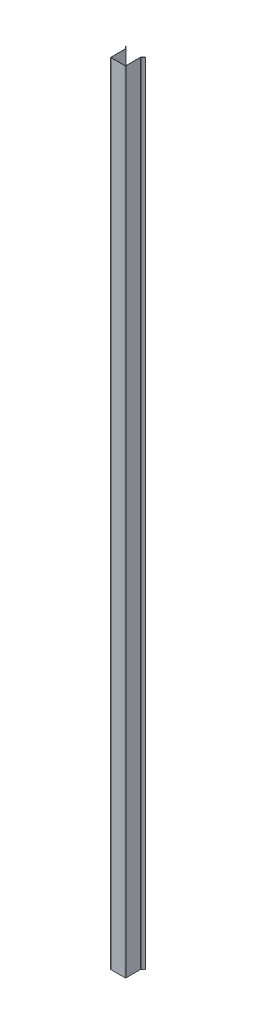
ISO-10303-21;
HEADER;
FILE_DESCRIPTION(('STEP AP214'),'2;1');
FILE_NAME('part.step','',(''),(''),'','','');
FILE_SCHEMA(('AUTOMOTIVE_DESIGN { 1 0 10303 214 1 1 1 1 }'));
ENDSEC;
DATA;
#1=APPLICATION_CONTEXT('core data for automotive mechanical design processes');
#2=APPLICATION_PROTOCOL_DEFINITION('international standard','automotive_design',2000,#1);
#3=PRODUCT_CONTEXT('',#1,'mechanical');
#4=PRODUCT('Part','Part','',(#3));
#5=PRODUCT_RELATED_PRODUCT_CATEGORY('part','',(#4));
#6=PRODUCT_DEFINITION_FORMATION('','',#4);
#7=PRODUCT_DEFINITION_CONTEXT('part definition',#1,'design');
#8=PRODUCT_DEFINITION('design','',#6,#7);
#9=PRODUCT_DEFINITION_SHAPE('','',#8);
#10=(LENGTH_UNIT() NAMED_UNIT(*) SI_UNIT(.MILLI.,.METRE.));
#11=(NAMED_UNIT(*) PLANE_ANGLE_UNIT() SI_UNIT($,.RADIAN.));
#12=(NAMED_UNIT(*) SI_UNIT($,.STERADIAN.) SOLID_ANGLE_UNIT());
#13=UNCERTAINTY_MEASURE_WITH_UNIT(LENGTH_MEASURE(1.E-05),#10,'distance_accuracy_value','');
#14=(GEOMETRIC_REPRESENTATION_CONTEXT(3) GLOBAL_UNCERTAINTY_ASSIGNED_CONTEXT((#13)) GLOBAL_UNIT_ASSIGNED_CONTEXT((#10,
#11,#12)) REPRESENTATION_CONTEXT('',''));
#15=CARTESIAN_POINT('',(0.,0.,0.));
#16=DIRECTION('',(0.,0.,1.));
#17=DIRECTION('',(1.,0.,0.));
#18=AXIS2_PLACEMENT_3D('',#15,#16,#17);
#19=CARTESIAN_POINT('',(-63.,6800.,0.));
#20=DIRECTION('',(-1.,0.,0.));
#21=DIRECTION('',(0.,0.,1.));
#22=AXIS2_PLACEMENT_3D('',#19,#20,#21);
#23=PLANE('',#22);
#24=DIRECTION('',(0.,0.,-1.));
#25=VECTOR('',#24,1.);
#26=CARTESIAN_POINT('',(-63.,6800.,0.));
#27=LINE('',#26,#25);
#28=CARTESIAN_POINT('',(-63.,6800.,-3.));
#29=VERTEX_POINT('',#28);
#30=CARTESIAN_POINT('',(-63.,6800.,-128.757359312881));
#31=VERTEX_POINT('',#30);
#32=EDGE_CURVE('E167',#29,#31,#27,.T.);
#33=ORIENTED_EDGE('',*,*,#32,.F.);
#34=DIRECTION('',(0.,-1.,0.));
#35=VECTOR('',#34,1.);
#36=CARTESIAN_POINT('',(-63.,0.,-3.));
#37=LINE('',#36,#35);
#38=CARTESIAN_POINT('',(-63.,0.,-3.));
#39=VERTEX_POINT('',#38);
#40=EDGE_CURVE('E288',#29,#39,#37,.T.);
#41=ORIENTED_EDGE('',*,*,#40,.T.);
#42=DIRECTION('',(0.,0.,-1.));
#43=VECTOR('',#42,1.);
#44=CARTESIAN_POINT('',(-63.,0.,0.));
#45=LINE('',#44,#43);
#46=CARTESIAN_POINT('',(-63.,0.,-128.757359312881));
#47=VERTEX_POINT('',#46);
#48=EDGE_CURVE('E207',#39,#47,#45,.T.);
#49=ORIENTED_EDGE('',*,*,#48,.T.);
#50=DIRECTION('',(0.,-1.,0.));
#51=VECTOR('',#50,1.);
#52=CARTESIAN_POINT('',(-63.,6800.,-128.757359312881));
#53=LINE('',#52,#51);
#54=EDGE_CURVE('E286',#47,#31,#53,.F.);
#55=ORIENTED_EDGE('',*,*,#54,.T.);
#56=EDGE_LOOP('',(#33,#41,#49,#55));
#57=FACE_BOUND('',#56,.T.);
#58=ADVANCED_FACE('F17',(#57),#23,.F.);
#59=CARTESIAN_POINT('',(-63.,6800.,-130.));
#60=DIRECTION('',(-0.707106781186547,0.,0.707106781186549));
#61=DIRECTION('',(0.707106781186549,0.,0.707106781186547));
#62=AXIS2_PLACEMENT_3D('',#59,#60,#61);
#63=PLANE('',#62);
#64=DIRECTION('',(-0.707106781186549,0.,-0.707106781186547));
#65=VECTOR('',#64,1.);
#66=CARTESIAN_POINT('',(-63.,6800.,-130.));
#67=LINE('',#66,#65);
#68=CARTESIAN_POINT('',(-63.8786796564404,6800.,-130.87867965644));
#69=VERTEX_POINT('',#68);
#70=CARTESIAN_POINT('',(-83.,6800.,-150.));
#71=VERTEX_POINT('',#70);
#72=EDGE_CURVE('E153',#69,#71,#67,.T.);
#73=ORIENTED_EDGE('',*,*,#72,.F.);
#74=DIRECTION('',(0.,-1.,0.));
#75=VECTOR('',#74,1.);
#76=CARTESIAN_POINT('',(-63.8786796564404,6800.,-130.87867965644));
#77=LINE('',#76,#75);
#78=CARTESIAN_POINT('',(-63.8786796564404,0.,-130.87867965644));
#79=VERTEX_POINT('',#78);
#80=EDGE_CURVE('E291',#69,#79,#77,.T.);
#81=ORIENTED_EDGE('',*,*,#80,.T.);
#82=DIRECTION('',(-0.707106781186549,0.,-0.707106781186547));
#83=VECTOR('',#82,1.);
#84=CARTESIAN_POINT('',(-63.,0.,-130.));
#85=LINE('',#84,#83);
#86=CARTESIAN_POINT('',(-83.,0.,-150.));
#87=VERTEX_POINT('',#86);
#88=EDGE_CURVE('E173',#79,#87,#85,.T.);
#89=ORIENTED_EDGE('',*,*,#88,.T.);
#90=DIRECTION('',(0.,-1.,0.));
#91=VECTOR('',#90,1.);
#92=CARTESIAN_POINT('',(-83.,6800.,-150.));
#93=LINE('',#92,#91);
#94=EDGE_CURVE('E170',#71,#87,#93,.T.);
#95=ORIENTED_EDGE('',*,*,#94,.F.);
#96=EDGE_LOOP('',(#73,#81,#89,#95));
#97=FACE_BOUND('',#96,.T.);
#98=ADVANCED_FACE('F171',(#97),#63,.F.);
#99=CARTESIAN_POINT('',(-84.0606601717798,6800.,-148.93933982822));
#100=DIRECTION('',(0.707106781186552,0.,0.707106781186543));
#101=DIRECTION('',(0.707106781186543,0.,-0.707106781186552));
#102=AXIS2_PLACEMENT_3D('',#99,#100,#101);
#103=PLANE('',#102);
#104=DIRECTION('',(-0.707106781186543,0.,0.707106781186552));
#105=VECTOR('',#104,1.);
#106=CARTESIAN_POINT('',(-84.0606601717798,0.,-148.93933982822));
#107=LINE('',#106,#105);
#108=CARTESIAN_POINT('',(-84.0606601717798,0.,-148.93933982822));
#109=VERTEX_POINT('',#108);
#110=EDGE_CURVE('E211',#87,#109,#107,.T.);
#111=ORIENTED_EDGE('',*,*,#110,.T.);
#112=DIRECTION('',(0.,-1.,0.));
#113=VECTOR('',#112,1.);
#114=CARTESIAN_POINT('',(-84.0606601717798,6800.,-148.93933982822));
#115=LINE('',#114,#113);
#116=CARTESIAN_POINT('',(-84.0606601717798,6800.,-148.93933982822));
#117=VERTEX_POINT('',#116);
#118=EDGE_CURVE('E177',#117,#109,#115,.T.);
#119=ORIENTED_EDGE('',*,*,#118,.F.);
#120=DIRECTION('',(-0.707106781186543,0.,0.707106781186552));
#121=VECTOR('',#120,1.);
#122=CARTESIAN_POINT('',(-84.0606601717798,6800.,-148.93933982822));
#123=LINE('',#122,#121);
#124=EDGE_CURVE('E159',#71,#117,#123,.T.);
#125=ORIENTED_EDGE('',*,*,#124,.F.);
#126=ORIENTED_EDGE('',*,*,#94,.T.);
#127=EDGE_LOOP('',(#111,#119,#125,#126));
#128=FACE_BOUND('',#127,.T.);
#129=ADVANCED_FACE('F179',(#128),#103,.F.);
#130=CARTESIAN_POINT('',(-64.5,6800.,-129.37867965644));
#131=DIRECTION('',(0.707106781186547,0.,-0.707106781186548));
#132=DIRECTION('',(-0.707106781186548,0.,-0.707106781186547));
#133=AXIS2_PLACEMENT_3D('',#130,#131,#132);
#134=PLANE('',#133);
#135=DIRECTION('',(0.707106781186548,0.,0.707106781186547));
#136=VECTOR('',#135,1.);
#137=CARTESIAN_POINT('',(-64.5,0.,-129.37867965644));
#138=LINE('',#137,#136);
#139=CARTESIAN_POINT('',(-65.3786796564404,0.,-130.257359312881));
#140=VERTEX_POINT('',#139);
#141=EDGE_CURVE('E213',#109,#140,#138,.T.);
#142=ORIENTED_EDGE('',*,*,#141,.T.);
#143=DIRECTION('',(0.,-1.,0.));
#144=VECTOR('',#143,1.);
#145=CARTESIAN_POINT('',(-65.3786796564404,6800.,-130.257359312881));
#146=LINE('',#145,#144);
#147=CARTESIAN_POINT('',(-65.3786796564404,6800.,-130.257359312881));
#148=VERTEX_POINT('',#147);
#149=EDGE_CURVE('E293',#140,#148,#146,.F.);
#150=ORIENTED_EDGE('',*,*,#149,.T.);
#151=DIRECTION('',(0.707106781186548,0.,0.707106781186547));
#152=VECTOR('',#151,1.);
#153=CARTESIAN_POINT('',(-64.5,6800.,-129.37867965644));
#154=LINE('',#153,#152);
#155=EDGE_CURVE('E182',#117,#148,#154,.T.);
#156=ORIENTED_EDGE('',*,*,#155,.F.);
#157=ORIENTED_EDGE('',*,*,#118,.T.);
#158=EDGE_LOOP('',(#142,#150,#156,#157));
#159=FACE_BOUND('',#158,.T.);
#160=ADVANCED_FACE('F314',(#159),#134,.F.);
#161=CARTESIAN_POINT('',(-64.5,6800.,1.5));
#162=DIRECTION('',(1.,0.,0.));
#163=DIRECTION('',(0.,0.,-1.));
#164=AXIS2_PLACEMENT_3D('',#161,#162,#163);
#165=PLANE('',#164);
#166=DIRECTION('',(0.,0.,1.));
#167=VECTOR('',#166,1.);
#168=CARTESIAN_POINT('',(-64.5,0.,1.5));
#169=LINE('',#168,#167);
#170=CARTESIAN_POINT('',(-64.5,0.,-128.136038969321));
#171=VERTEX_POINT('',#170);
#172=CARTESIAN_POINT('',(-64.5,0.,-1.5));
#173=VERTEX_POINT('',#172);
#174=EDGE_CURVE('E216',#171,#173,#169,.T.);
#175=ORIENTED_EDGE('',*,*,#174,.T.);
#176=DIRECTION('',(0.,-1.,0.));
#177=VECTOR('',#176,1.);
#178=CARTESIAN_POINT('',(-64.5,6800.,-1.5));
#179=LINE('',#178,#177);
#180=CARTESIAN_POINT('',(-64.5,6800.,-1.5));
#181=VERTEX_POINT('',#180);
#182=EDGE_CURVE('E284',#173,#181,#179,.F.);
#183=ORIENTED_EDGE('',*,*,#182,.T.);
#184=DIRECTION('',(0.,0.,1.));
#185=VECTOR('',#184,1.);
#186=CARTESIAN_POINT('',(-64.5,6800.,1.5));
#187=LINE('',#186,#185);
#188=CARTESIAN_POINT('',(-64.5,6800.,-128.136038969321));
#189=VERTEX_POINT('',#188);
#190=EDGE_CURVE('E184',#189,#181,#187,.T.);
#191=ORIENTED_EDGE('',*,*,#190,.F.);
#192=DIRECTION('',(0.,-1.,0.));
#193=VECTOR('',#192,1.);
#194=CARTESIAN_POINT('',(-64.5,0.,-128.136038969321));
#195=LINE('',#194,#193);
#196=EDGE_CURVE('E281',#189,#171,#195,.T.);
#197=ORIENTED_EDGE('',*,*,#196,.T.);
#198=EDGE_LOOP('',(#175,#183,#191,#197));
#199=FACE_BOUND('',#198,.T.);
#200=ADVANCED_FACE('F319',(#199),#165,.F.);
#201=CARTESIAN_POINT('',(-64.5,6800.,1.5));
#202=DIRECTION('',(0.,0.,-1.));
#203=DIRECTION('',(-1.,0.,0.));
#204=AXIS2_PLACEMENT_3D('',#201,#202,#203);
#205=PLANE('',#204);
#206=DIRECTION('',(1.,0.,0.));
#207=VECTOR('',#206,1.);
#208=CARTESIAN_POINT('',(-64.5,0.,1.5));
#209=LINE('',#208,#207);
#210=CARTESIAN_POINT('',(-61.5,0.,1.5));
#211=VERTEX_POINT('',#210);
#212=CARTESIAN_POINT('',(61.5,0.,1.5));
#213=VERTEX_POINT('',#212);
#214=EDGE_CURVE('E219',#211,#213,#209,.T.);
#215=ORIENTED_EDGE('',*,*,#214,.T.);
#216=DIRECTION('',(0.,-1.,0.));
#217=VECTOR('',#216,1.);
#218=CARTESIAN_POINT('',(61.5,6800.,1.5));
#219=LINE('',#218,#217);
#220=CARTESIAN_POINT('',(61.5,6800.,1.5));
#221=VERTEX_POINT('',#220);
#222=EDGE_CURVE('E258',#213,#221,#219,.F.);
#223=ORIENTED_EDGE('',*,*,#222,.T.);
#224=DIRECTION('',(1.,0.,0.));
#225=VECTOR('',#224,1.);
#226=CARTESIAN_POINT('',(-64.5,6800.,1.5));
#227=LINE('',#226,#225);
#228=CARTESIAN_POINT('',(-61.5,6800.,1.5));
#229=VERTEX_POINT('',#228);
#230=EDGE_CURVE('E190',#229,#221,#227,.T.);
#231=ORIENTED_EDGE('',*,*,#230,.F.);
#232=DIRECTION('',(0.,-1.,0.));
#233=VECTOR('',#232,1.);
#234=CARTESIAN_POINT('',(-61.5,6800.,1.5));
#235=LINE('',#234,#233);
#236=EDGE_CURVE('E255',#229,#211,#235,.T.);
#237=ORIENTED_EDGE('',*,*,#236,.T.);
#238=EDGE_LOOP('',(#215,#223,#231,#237));
#239=FACE_BOUND('',#238,.T.);
#240=ADVANCED_FACE('F327',(#239),#205,.F.);
#241=CARTESIAN_POINT('',(64.5,6800.,1.5));
#242=DIRECTION('',(-1.,0.,0.));
#243=DIRECTION('',(0.,0.,1.));
#244=AXIS2_PLACEMENT_3D('',#241,#242,#243);
#245=PLANE('',#244);
#246=DIRECTION('',(0.,0.,-1.));
#247=VECTOR('',#246,1.);
#248=CARTESIAN_POINT('',(64.5,6800.,1.5));
#249=LINE('',#248,#247);
#250=CARTESIAN_POINT('',(64.5,6800.,-1.5));
#251=VERTEX_POINT('',#250);
#252=CARTESIAN_POINT('',(64.5,6800.,-128.136038969321));
#253=VERTEX_POINT('',#252);
#254=EDGE_CURVE('E192',#251,#253,#249,.T.);
#255=ORIENTED_EDGE('',*,*,#254,.F.);
#256=DIRECTION('',(0.,-1.,0.));
#257=VECTOR('',#256,1.);
#258=CARTESIAN_POINT('',(64.5,6800.,-1.5));
#259=LINE('',#258,#257);
#260=CARTESIAN_POINT('',(64.5,0.,-1.5));
#261=VERTEX_POINT('',#260);
#262=EDGE_CURVE('E244',#251,#261,#259,.T.);
#263=ORIENTED_EDGE('',*,*,#262,.T.);
#264=DIRECTION('',(0.,0.,-1.));
#265=VECTOR('',#264,1.);
#266=CARTESIAN_POINT('',(64.5,0.,1.5));
#267=LINE('',#266,#265);
#268=CARTESIAN_POINT('',(64.5,0.,-128.136038969321));
#269=VERTEX_POINT('',#268);
#270=EDGE_CURVE('E222',#261,#269,#267,.T.);
#271=ORIENTED_EDGE('',*,*,#270,.T.);
#272=DIRECTION('',(0.,-1.,0.));
#273=VECTOR('',#272,1.);
#274=CARTESIAN_POINT('',(64.5,6800.,-128.136038969321));
#275=LINE('',#274,#273);
#276=EDGE_CURVE('E176',#269,#253,#275,.F.);
#277=ORIENTED_EDGE('',*,*,#276,.T.);
#278=EDGE_LOOP('',(#255,#263,#271,#277));
#279=FACE_BOUND('',#278,.T.);
#280=ADVANCED_FACE('F336',(#279),#245,.F.);
#281=CARTESIAN_POINT('',(64.5,6800.,-129.37867965644));
#282=DIRECTION('',(-0.707106781186547,0.,-0.707106781186548));
#283=DIRECTION('',(-0.707106781186548,0.,0.707106781186547));
#284=AXIS2_PLACEMENT_3D('',#281,#282,#283);
#285=PLANE('',#284);
#286=DIRECTION('',(0.707106781186548,0.,-0.707106781186547));
#287=VECTOR('',#286,1.);
#288=CARTESIAN_POINT('',(64.5,6800.,-129.37867965644));
#289=LINE('',#288,#287);
#290=CARTESIAN_POINT('',(65.3786796564404,6800.,-130.257359312881));
#291=VERTEX_POINT('',#290);
#292=CARTESIAN_POINT('',(84.0606601717798,6800.,-148.93933982822));
#293=VERTEX_POINT('',#292);
#294=EDGE_CURVE('E195',#291,#293,#289,.T.);
#295=ORIENTED_EDGE('',*,*,#294,.F.);
#296=DIRECTION('',(0.,-1.,0.));
#297=VECTOR('',#296,1.);
#298=CARTESIAN_POINT('',(65.3786796564404,0.,-130.257359312881));
#299=LINE('',#298,#297);
#300=CARTESIAN_POINT('',(65.3786796564404,0.,-130.257359312881));
#301=VERTEX_POINT('',#300);
#302=EDGE_CURVE('E267',#291,#301,#299,.T.);
#303=ORIENTED_EDGE('',*,*,#302,.T.);
#304=DIRECTION('',(0.707106781186548,0.,-0.707106781186547));
#305=VECTOR('',#304,1.);
#306=CARTESIAN_POINT('',(64.5,0.,-129.37867965644));
#307=LINE('',#306,#305);
#308=CARTESIAN_POINT('',(84.0606601717798,0.,-148.93933982822));
#309=VERTEX_POINT('',#308);
#310=EDGE_CURVE('E225',#301,#309,#307,.T.);
#311=ORIENTED_EDGE('',*,*,#310,.T.);
#312=DIRECTION('',(0.,-1.,0.));
#313=VECTOR('',#312,1.);
#314=CARTESIAN_POINT('',(84.0606601717798,6800.,-148.93933982822));
#315=LINE('',#314,#313);
#316=EDGE_CURVE('E239',#293,#309,#315,.T.);
#317=ORIENTED_EDGE('',*,*,#316,.F.);
#318=EDGE_LOOP('',(#295,#303,#311,#317));
#319=FACE_BOUND('',#318,.T.);
#320=ADVANCED_FACE('F344',(#319),#285,.F.);
#321=CARTESIAN_POINT('',(83.,6800.,-150.));
#322=DIRECTION('',(-0.707106781186552,0.,0.707106781186543));
#323=DIRECTION('',(0.707106781186543,0.,0.707106781186552));
#324=AXIS2_PLACEMENT_3D('',#321,#322,#323);
#325=PLANE('',#324);
#326=DIRECTION('',(-0.707106781186543,0.,-0.707106781186552));
#327=VECTOR('',#326,1.);
#328=CARTESIAN_POINT('',(83.,0.,-150.));
#329=LINE('',#328,#327);
#330=CARTESIAN_POINT('',(83.,0.,-150.));
#331=VERTEX_POINT('',#330);
#332=EDGE_CURVE('E227',#309,#331,#329,.T.);
#333=ORIENTED_EDGE('',*,*,#332,.T.);
#334=DIRECTION('',(0.,-1.,0.));
#335=VECTOR('',#334,1.);
#336=CARTESIAN_POINT('',(83.,6800.,-150.));
#337=LINE('',#336,#335);
#338=CARTESIAN_POINT('',(83.,6800.,-150.));
#339=VERTEX_POINT('',#338);
#340=EDGE_CURVE('E206',#339,#331,#337,.T.);
#341=ORIENTED_EDGE('',*,*,#340,.F.);
#342=DIRECTION('',(-0.707106781186543,0.,-0.707106781186552));
#343=VECTOR('',#342,1.);
#344=CARTESIAN_POINT('',(83.,6800.,-150.));
#345=LINE('',#344,#343);
#346=EDGE_CURVE('E197',#293,#339,#345,.T.);
#347=ORIENTED_EDGE('',*,*,#346,.F.);
#348=ORIENTED_EDGE('',*,*,#316,.T.);
#349=EDGE_LOOP('',(#333,#341,#347,#348));
#350=FACE_BOUND('',#349,.T.);
#351=ADVANCED_FACE('F350',(#350),#325,.F.);
#352=CARTESIAN_POINT('',(63.,6800.,-130.));
#353=DIRECTION('',(0.707106781186547,0.,0.707106781186549));
#354=DIRECTION('',(0.707106781186549,0.,-0.707106781186547));
#355=AXIS2_PLACEMENT_3D('',#352,#353,#354);
#356=PLANE('',#355);
#357=DIRECTION('',(-0.707106781186549,0.,0.707106781186547));
#358=VECTOR('',#357,1.);
#359=CARTESIAN_POINT('',(63.,0.,-130.));
#360=LINE('',#359,#358);
#361=CARTESIAN_POINT('',(63.8786796564404,0.,-130.87867965644));
#362=VERTEX_POINT('',#361);
#363=EDGE_CURVE('E229',#331,#362,#360,.T.);
#364=ORIENTED_EDGE('',*,*,#363,.T.);
#365=DIRECTION('',(0.,-1.,0.));
#366=VECTOR('',#365,1.);
#367=CARTESIAN_POINT('',(63.8786796564404,6800.,-130.87867965644));
#368=LINE('',#367,#366);
#369=CARTESIAN_POINT('',(63.8786796564404,6800.,-130.87867965644));
#370=VERTEX_POINT('',#369);
#371=EDGE_CURVE('E275',#362,#370,#368,.F.);
#372=ORIENTED_EDGE('',*,*,#371,.T.);
#373=DIRECTION('',(-0.707106781186549,0.,0.707106781186547));
#374=VECTOR('',#373,1.);
#375=CARTESIAN_POINT('',(63.,6800.,-130.));
#376=LINE('',#375,#374);
#377=EDGE_CURVE('E199',#339,#370,#376,.T.);
#378=ORIENTED_EDGE('',*,*,#377,.F.);
#379=ORIENTED_EDGE('',*,*,#340,.T.);
#380=EDGE_LOOP('',(#364,#372,#378,#379));
#381=FACE_BOUND('',#380,.T.);
#382=ADVANCED_FACE('F482',(#381),#356,.F.);
#383=CARTESIAN_POINT('',(63.,6800.,0.));
#384=DIRECTION('',(1.,0.,0.));
#385=DIRECTION('',(0.,0.,-1.));
#386=AXIS2_PLACEMENT_3D('',#383,#384,#385);
#387=PLANE('',#386);
#388=DIRECTION('',(0.,0.,1.));
#389=VECTOR('',#388,1.);
#390=CARTESIAN_POINT('',(63.,6800.,0.));
#391=LINE('',#390,#389);
#392=CARTESIAN_POINT('',(63.,6800.,-128.757359312881));
#393=VERTEX_POINT('',#392);
#394=CARTESIAN_POINT('',(63.,6800.,-3.));
#395=VERTEX_POINT('',#394);
#396=EDGE_CURVE('E202',#393,#395,#391,.T.);
#397=ORIENTED_EDGE('',*,*,#396,.F.);
#398=DIRECTION('',(0.,-1.,0.));
#399=VECTOR('',#398,1.);
#400=CARTESIAN_POINT('',(63.,6800.,-128.757359312881));
#401=LINE('',#400,#399);
#402=CARTESIAN_POINT('',(63.,0.,-128.757359312881));
#403=VERTEX_POINT('',#402);
#404=EDGE_CURVE('E272',#393,#403,#401,.T.);
#405=ORIENTED_EDGE('',*,*,#404,.T.);
#406=DIRECTION('',(0.,0.,1.));
#407=VECTOR('',#406,1.);
#408=CARTESIAN_POINT('',(63.,0.,0.));
#409=LINE('',#408,#407);
#410=CARTESIAN_POINT('',(63.,0.,-3.));
#411=VERTEX_POINT('',#410);
#412=EDGE_CURVE('E232',#403,#411,#409,.T.);
#413=ORIENTED_EDGE('',*,*,#412,.T.);
#414=DIRECTION('',(0.,-1.,0.));
#415=VECTOR('',#414,1.);
#416=CARTESIAN_POINT('',(63.,6800.,-3.));
#417=LINE('',#416,#415);
#418=EDGE_CURVE('E270',#411,#395,#417,.F.);
#419=ORIENTED_EDGE('',*,*,#418,.T.);
#420=EDGE_LOOP('',(#397,#405,#413,#419));
#421=FACE_BOUND('',#420,.T.);
#422=ADVANCED_FACE('F361',(#421),#387,.F.);
#423=CARTESIAN_POINT('',(-63.,6800.,0.));
#424=DIRECTION('',(0.,0.,1.));
#425=DIRECTION('',(1.,0.,0.));
#426=AXIS2_PLACEMENT_3D('',#423,#424,#425);
#427=PLANE('',#426);
#428=DIRECTION('',(-1.,0.,0.));
#429=VECTOR('',#428,1.);
#430=CARTESIAN_POINT('',(-63.,6800.,0.));
#431=LINE('',#430,#429);
#432=CARTESIAN_POINT('',(60.,6800.,0.));
#433=VERTEX_POINT('',#432);
#434=CARTESIAN_POINT('',(-60.,6800.,0.));
#435=VERTEX_POINT('',#434);
#436=EDGE_CURVE('E204',#433,#435,#431,.T.);
#437=ORIENTED_EDGE('',*,*,#436,.F.);
#438=DIRECTION('',(0.,-1.,0.));
#439=VECTOR('',#438,1.);
#440=CARTESIAN_POINT('',(60.,0.,0.));
#441=LINE('',#440,#439);
#442=CARTESIAN_POINT('',(60.,0.,0.));
#443=VERTEX_POINT('',#442);
#444=EDGE_CURVE('E278',#433,#443,#441,.T.);
#445=ORIENTED_EDGE('',*,*,#444,.T.);
#446=DIRECTION('',(-1.,0.,0.));
#447=VECTOR('',#446,1.);
#448=CARTESIAN_POINT('',(-63.,0.,0.));
#449=LINE('',#448,#447);
#450=CARTESIAN_POINT('',(-60.,0.,0.));
#451=VERTEX_POINT('',#450);
#452=EDGE_CURVE('E235',#443,#451,#449,.T.);
#453=ORIENTED_EDGE('',*,*,#452,.T.);
#454=DIRECTION('',(0.,-1.,0.));
#455=VECTOR('',#454,1.);
#456=CARTESIAN_POINT('',(-60.,6800.,0.));
#457=LINE('',#456,#455);
#458=EDGE_CURVE('E32',#451,#435,#457,.F.);
#459=ORIENTED_EDGE('',*,*,#458,.T.);
#460=EDGE_LOOP('',(#437,#445,#453,#459));
#461=FACE_BOUND('',#460,.T.);
#462=ADVANCED_FACE('F368',(#461),#427,.F.);
#463=CARTESIAN_POINT('',(0.,6800.,0.));
#464=DIRECTION('',(0.,-1.,0.));
#465=DIRECTION('',(0.,0.,-1.));
#466=AXIS2_PLACEMENT_3D('',#463,#464,#465);
#467=PLANE('',#466);
#468=ORIENTED_EDGE('',*,*,#230,.T.);
#469=CARTESIAN_POINT('',(61.5,6800.,-1.5));
#470=DIRECTION('',(0.,-1.,0.));
#471=DIRECTION('',(0.,0.,-1.));
#472=AXIS2_PLACEMENT_3D('',#469,#470,#471);
#473=CIRCLE('',#472,3.);
#474=EDGE_CURVE('E265',#221,#251,#473,.F.);
#475=ORIENTED_EDGE('',*,*,#474,.T.);
#476=ORIENTED_EDGE('',*,*,#254,.T.);
#477=CARTESIAN_POINT('',(67.5,6800.,-128.136038969321));
#478=DIRECTION('',(0.,-1.,0.));
#479=DIRECTION('',(0.,0.,-1.));
#480=AXIS2_PLACEMENT_3D('',#477,#478,#479);
#481=CIRCLE('',#480,3.);
#482=EDGE_CURVE('E297',#253,#291,#481,.T.);
#483=ORIENTED_EDGE('',*,*,#482,.T.);
#484=ORIENTED_EDGE('',*,*,#294,.T.);
#485=ORIENTED_EDGE('',*,*,#346,.T.);
#486=ORIENTED_EDGE('',*,*,#377,.T.);
#487=CARTESIAN_POINT('',(66.,6800.,-128.757359312881));
#488=DIRECTION('',(0.,-1.,0.));
#489=DIRECTION('',(0.,0.,-1.));
#490=AXIS2_PLACEMENT_3D('',#487,#488,#489);
#491=CIRCLE('',#490,3.);
#492=EDGE_CURVE('E263',#370,#393,#491,.F.);
#493=ORIENTED_EDGE('',*,*,#492,.T.);
#494=ORIENTED_EDGE('',*,*,#396,.T.);
#495=CARTESIAN_POINT('',(60.,6800.,-3.));
#496=DIRECTION('',(0.,-1.,0.));
#497=DIRECTION('',(0.,0.,-1.));
#498=AXIS2_PLACEMENT_3D('',#495,#496,#497);
#499=CIRCLE('',#498,3.);
#500=EDGE_CURVE('E39',#395,#433,#499,.T.);
#501=ORIENTED_EDGE('',*,*,#500,.T.);
#502=ORIENTED_EDGE('',*,*,#436,.T.);
#503=CARTESIAN_POINT('',(-60.,6800.,-3.));
#504=DIRECTION('',(0.,-1.,0.));
#505=DIRECTION('',(0.,0.,-1.));
#506=AXIS2_PLACEMENT_3D('',#503,#504,#505);
#507=CIRCLE('',#506,3.);
#508=EDGE_CURVE('E304',#435,#29,#507,.T.);
#509=ORIENTED_EDGE('',*,*,#508,.T.);
#510=ORIENTED_EDGE('',*,*,#32,.T.);
#511=CARTESIAN_POINT('',(-66.,6800.,-128.757359312881));
#512=DIRECTION('',(0.,-1.,0.));
#513=DIRECTION('',(0.,0.,-1.));
#514=AXIS2_PLACEMENT_3D('',#511,#512,#513);
#515=CIRCLE('',#514,3.);
#516=EDGE_CURVE('E163',#31,#69,#515,.F.);
#517=ORIENTED_EDGE('',*,*,#516,.T.);
#518=ORIENTED_EDGE('',*,*,#72,.T.);
#519=ORIENTED_EDGE('',*,*,#124,.T.);
#520=ORIENTED_EDGE('',*,*,#155,.T.);
#521=CARTESIAN_POINT('',(-67.5,6800.,-128.136038969321));
#522=DIRECTION('',(0.,-1.,0.));
#523=DIRECTION('',(0.,0.,-1.));
#524=AXIS2_PLACEMENT_3D('',#521,#522,#523);
#525=CIRCLE('',#524,3.);
#526=EDGE_CURVE('E11',#148,#189,#525,.T.);
#527=ORIENTED_EDGE('',*,*,#526,.T.);
#528=ORIENTED_EDGE('',*,*,#190,.T.);
#529=CARTESIAN_POINT('',(-61.5,6800.,-1.5));
#530=DIRECTION('',(0.,-1.,0.));
#531=DIRECTION('',(0.,0.,-1.));
#532=AXIS2_PLACEMENT_3D('',#529,#530,#531);
#533=CIRCLE('',#532,3.);
#534=EDGE_CURVE('E261',#181,#229,#533,.F.);
#535=ORIENTED_EDGE('',*,*,#534,.T.);
#536=EDGE_LOOP('',(#468,#475,#476,#483,#484,#485,#486,#493,#494,#501,#502,#509,#510,#517,#518,
#519,#520,#527,#528,#535));
#537=FACE_BOUND('',#536,.T.);
#538=ADVANCED_FACE('F156',(#537),#467,.F.);
#539=CARTESIAN_POINT('',(0.,0.,0.));
#540=DIRECTION('',(0.,-1.,0.));
#541=DIRECTION('',(0.,0.,-1.));
#542=AXIS2_PLACEMENT_3D('',#539,#540,#541);
#543=PLANE('',#542);
#544=ORIENTED_EDGE('',*,*,#270,.F.);
#545=CARTESIAN_POINT('',(61.5,0.,-1.5));
#546=DIRECTION('',(0.,-1.,0.));
#547=DIRECTION('',(0.,0.,-1.));
#548=AXIS2_PLACEMENT_3D('',#545,#546,#547);
#549=CIRCLE('',#548,3.);
#550=EDGE_CURVE('E253',#261,#213,#549,.T.);
#551=ORIENTED_EDGE('',*,*,#550,.T.);
#552=ORIENTED_EDGE('',*,*,#214,.F.);
#553=CARTESIAN_POINT('',(-61.5,0.,-1.5));
#554=DIRECTION('',(0.,-1.,0.));
#555=DIRECTION('',(0.,0.,-1.));
#556=AXIS2_PLACEMENT_3D('',#553,#554,#555);
#557=CIRCLE('',#556,3.);
#558=EDGE_CURVE('E249',#211,#173,#557,.T.);
#559=ORIENTED_EDGE('',*,*,#558,.T.);
#560=ORIENTED_EDGE('',*,*,#174,.F.);
#561=CARTESIAN_POINT('',(-67.5,0.,-128.136038969321));
#562=DIRECTION('',(0.,-1.,0.));
#563=DIRECTION('',(0.,0.,-1.));
#564=AXIS2_PLACEMENT_3D('',#561,#562,#563);
#565=CIRCLE('',#564,3.);
#566=EDGE_CURVE('E25',#171,#140,#565,.F.);
#567=ORIENTED_EDGE('',*,*,#566,.T.);
#568=ORIENTED_EDGE('',*,*,#141,.F.);
#569=ORIENTED_EDGE('',*,*,#110,.F.);
#570=ORIENTED_EDGE('',*,*,#88,.F.);
#571=CARTESIAN_POINT('',(-66.,0.,-128.757359312881));
#572=DIRECTION('',(0.,-1.,0.));
#573=DIRECTION('',(0.,0.,-1.));
#574=AXIS2_PLACEMENT_3D('',#571,#572,#573);
#575=CIRCLE('',#574,3.);
#576=EDGE_CURVE('E247',#79,#47,#575,.T.);
#577=ORIENTED_EDGE('',*,*,#576,.T.);
#578=ORIENTED_EDGE('',*,*,#48,.F.);
#579=CARTESIAN_POINT('',(-60.,0.,-3.));
#580=DIRECTION('',(0.,-1.,0.));
#581=DIRECTION('',(0.,0.,-1.));
#582=AXIS2_PLACEMENT_3D('',#579,#580,#581);
#583=CIRCLE('',#582,3.);
#584=EDGE_CURVE('E302',#39,#451,#583,.F.);
#585=ORIENTED_EDGE('',*,*,#584,.T.);
#586=ORIENTED_EDGE('',*,*,#452,.F.);
#587=CARTESIAN_POINT('',(60.,0.,-3.));
#588=DIRECTION('',(0.,-1.,0.));
#589=DIRECTION('',(0.,0.,-1.));
#590=AXIS2_PLACEMENT_3D('',#587,#588,#589);
#591=CIRCLE('',#590,3.);
#592=EDGE_CURVE('E299',#443,#411,#591,.F.);
#593=ORIENTED_EDGE('',*,*,#592,.T.);
#594=ORIENTED_EDGE('',*,*,#412,.F.);
#595=CARTESIAN_POINT('',(66.,0.,-128.757359312881));
#596=DIRECTION('',(0.,-1.,0.));
#597=DIRECTION('',(0.,0.,-1.));
#598=AXIS2_PLACEMENT_3D('',#595,#596,#597);
#599=CIRCLE('',#598,3.);
#600=EDGE_CURVE('E251',#403,#362,#599,.T.);
#601=ORIENTED_EDGE('',*,*,#600,.T.);
#602=ORIENTED_EDGE('',*,*,#363,.F.);
#603=ORIENTED_EDGE('',*,*,#332,.F.);
#604=ORIENTED_EDGE('',*,*,#310,.F.);
#605=CARTESIAN_POINT('',(67.5,0.,-128.136038969321));
#606=DIRECTION('',(0.,-1.,0.));
#607=DIRECTION('',(0.,0.,-1.));
#608=AXIS2_PLACEMENT_3D('',#605,#606,#607);
#609=CIRCLE('',#608,3.);
#610=EDGE_CURVE('E295',#301,#269,#609,.F.);
#611=ORIENTED_EDGE('',*,*,#610,.T.);
#612=EDGE_LOOP('',(#544,#551,#552,#559,#560,#567,#568,#569,#570,#577,#578,#585,#586,#593,#594,
#601,#602,#603,#604,#611));
#613=FACE_BOUND('',#612,.T.);
#614=ADVANCED_FACE('F309',(#613),#543,.T.);
#615=CARTESIAN_POINT('',(61.5,6800.,-1.5));
#616=DIRECTION('',(0.,-1.,0.));
#617=DIRECTION('',(0.,0.,-1.));
#618=AXIS2_PLACEMENT_3D('',#615,#616,#617);
#619=CYLINDRICAL_SURFACE('',#618,3.);
#620=ORIENTED_EDGE('',*,*,#474,.F.);
#621=ORIENTED_EDGE('',*,*,#222,.F.);
#622=ORIENTED_EDGE('',*,*,#550,.F.);
#623=ORIENTED_EDGE('',*,*,#262,.F.);
#624=EDGE_LOOP('',(#620,#621,#622,#623));
#625=FACE_BOUND('',#624,.T.);
#626=ADVANCED_FACE('F331',(#625),#619,.T.);
#627=CARTESIAN_POINT('',(67.5,6800.,-128.136038969321));
#628=DIRECTION('',(0.,1.,0.));
#629=DIRECTION('',(0.,0.,1.));
#630=AXIS2_PLACEMENT_3D('',#627,#628,#629);
#631=CYLINDRICAL_SURFACE('',#630,3.);
#632=ORIENTED_EDGE('',*,*,#482,.F.);
#633=ORIENTED_EDGE('',*,*,#276,.F.);
#634=ORIENTED_EDGE('',*,*,#610,.F.);
#635=ORIENTED_EDGE('',*,*,#302,.F.);
#636=EDGE_LOOP('',(#632,#633,#634,#635));
#637=FACE_BOUND('',#636,.T.);
#638=ADVANCED_FACE('F339',(#637),#631,.F.);
#639=CARTESIAN_POINT('',(66.,6800.,-128.757359312881));
#640=DIRECTION('',(0.,-1.,0.));
#641=DIRECTION('',(0.,0.,-1.));
#642=AXIS2_PLACEMENT_3D('',#639,#640,#641);
#643=CYLINDRICAL_SURFACE('',#642,3.);
#644=ORIENTED_EDGE('',*,*,#492,.F.);
#645=ORIENTED_EDGE('',*,*,#371,.F.);
#646=ORIENTED_EDGE('',*,*,#600,.F.);
#647=ORIENTED_EDGE('',*,*,#404,.F.);
#648=EDGE_LOOP('',(#644,#645,#646,#647));
#649=FACE_BOUND('',#648,.T.);
#650=ADVANCED_FACE('F358',(#649),#643,.T.);
#651=CARTESIAN_POINT('',(60.,6800.,-3.));
#652=DIRECTION('',(0.,1.,0.));
#653=DIRECTION('',(0.,0.,1.));
#654=AXIS2_PLACEMENT_3D('',#651,#652,#653);
#655=CYLINDRICAL_SURFACE('',#654,3.);
#656=ORIENTED_EDGE('',*,*,#500,.F.);
#657=ORIENTED_EDGE('',*,*,#418,.F.);
#658=ORIENTED_EDGE('',*,*,#592,.F.);
#659=ORIENTED_EDGE('',*,*,#444,.F.);
#660=EDGE_LOOP('',(#656,#657,#658,#659));
#661=FACE_BOUND('',#660,.T.);
#662=ADVANCED_FACE('F367',(#661),#655,.F.);
#663=CARTESIAN_POINT('',(-61.5,6800.,-1.5));
#664=DIRECTION('',(0.,-1.,0.));
#665=DIRECTION('',(0.,0.,-1.));
#666=AXIS2_PLACEMENT_3D('',#663,#664,#665);
#667=CYLINDRICAL_SURFACE('',#666,3.);
#668=ORIENTED_EDGE('',*,*,#534,.F.);
#669=ORIENTED_EDGE('',*,*,#182,.F.);
#670=ORIENTED_EDGE('',*,*,#558,.F.);
#671=ORIENTED_EDGE('',*,*,#236,.F.);
#672=EDGE_LOOP('',(#668,#669,#670,#671));
#673=FACE_BOUND('',#672,.T.);
#674=ADVANCED_FACE('F322',(#673),#667,.T.);
#675=CARTESIAN_POINT('',(-60.,6800.,-3.));
#676=DIRECTION('',(0.,1.,0.));
#677=DIRECTION('',(0.,0.,1.));
#678=AXIS2_PLACEMENT_3D('',#675,#676,#677);
#679=CYLINDRICAL_SURFACE('',#678,3.);
#680=ORIENTED_EDGE('',*,*,#508,.F.);
#681=ORIENTED_EDGE('',*,*,#458,.F.);
#682=ORIENTED_EDGE('',*,*,#584,.F.);
#683=ORIENTED_EDGE('',*,*,#40,.F.);
#684=EDGE_LOOP('',(#680,#681,#682,#683));
#685=FACE_BOUND('',#684,.T.);
#686=ADVANCED_FACE('F373',(#685),#679,.F.);
#687=CARTESIAN_POINT('',(-66.,6800.,-128.757359312881));
#688=DIRECTION('',(0.,-1.,0.));
#689=DIRECTION('',(0.,0.,-1.));
#690=AXIS2_PLACEMENT_3D('',#687,#688,#689);
#691=CYLINDRICAL_SURFACE('',#690,3.);
#692=ORIENTED_EDGE('',*,*,#516,.F.);
#693=ORIENTED_EDGE('',*,*,#54,.F.);
#694=ORIENTED_EDGE('',*,*,#576,.F.);
#695=ORIENTED_EDGE('',*,*,#80,.F.);
#696=EDGE_LOOP('',(#692,#693,#694,#695));
#697=FACE_BOUND('',#696,.T.);
#698=ADVANCED_FACE('F378',(#697),#691,.T.);
#699=CARTESIAN_POINT('',(-67.5,6800.,-128.136038969321));
#700=DIRECTION('',(0.,1.,0.));
#701=DIRECTION('',(0.,0.,1.));
#702=AXIS2_PLACEMENT_3D('',#699,#700,#701);
#703=CYLINDRICAL_SURFACE('',#702,3.);
#704=ORIENTED_EDGE('',*,*,#526,.F.);
#705=ORIENTED_EDGE('',*,*,#149,.F.);
#706=ORIENTED_EDGE('',*,*,#566,.F.);
#707=ORIENTED_EDGE('',*,*,#196,.F.);
#708=EDGE_LOOP('',(#704,#705,#706,#707));
#709=FACE_BOUND('',#708,.T.);
#710=ADVANCED_FACE('F19',(#709),#703,.F.);
#711=CLOSED_SHELL('',(#58,#98,#129,#160,#200,#240,#280,#320,#351,#382,#422,#462,#538,#614,#626,
#638,#650,#662,#674,#686,#698,#710));
#712=MANIFOLD_SOLID_BREP('B1',#711);
#713=ADVANCED_BREP_SHAPE_REPRESENTATION('',(#18,#712),#14);
#714=SHAPE_DEFINITION_REPRESENTATION(#9,#713);
ENDSEC;
END-ISO-10303-21;
